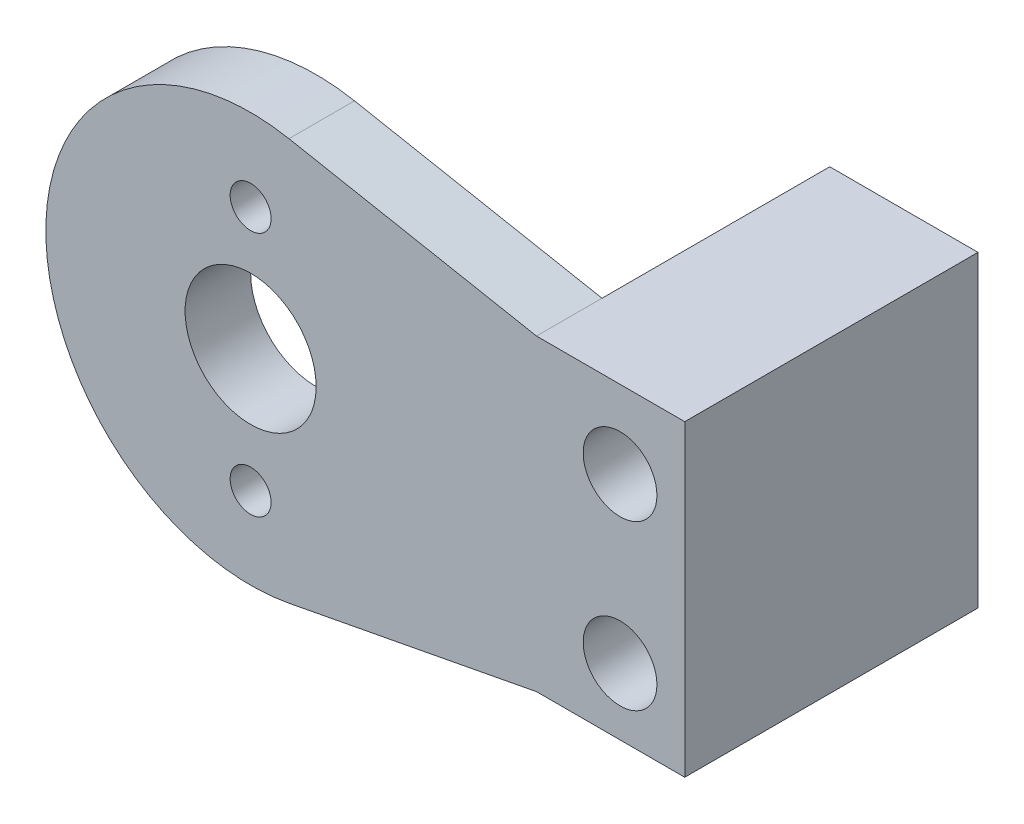
ISO-10303-21;
HEADER;
FILE_DESCRIPTION(('STEP AP214'),'2;1');
FILE_NAME('part.step','',(''),(''),'','','');
FILE_SCHEMA(('AUTOMOTIVE_DESIGN { 1 0 10303 214 1 1 1 1 }'));
ENDSEC;
DATA;
#1=APPLICATION_CONTEXT('core data for automotive mechanical design processes');
#2=APPLICATION_PROTOCOL_DEFINITION('international standard','automotive_design',2000,#1);
#3=PRODUCT_CONTEXT('',#1,'mechanical');
#4=PRODUCT('Part','Part','',(#3));
#5=PRODUCT_RELATED_PRODUCT_CATEGORY('part','',(#4));
#6=PRODUCT_DEFINITION_FORMATION('','',#4);
#7=PRODUCT_DEFINITION_CONTEXT('part definition',#1,'design');
#8=PRODUCT_DEFINITION('design','',#6,#7);
#9=PRODUCT_DEFINITION_SHAPE('','',#8);
#10=(LENGTH_UNIT() NAMED_UNIT(*) SI_UNIT(.MILLI.,.METRE.));
#11=(NAMED_UNIT(*) PLANE_ANGLE_UNIT() SI_UNIT($,.RADIAN.));
#12=(NAMED_UNIT(*) SI_UNIT($,.STERADIAN.) SOLID_ANGLE_UNIT());
#13=UNCERTAINTY_MEASURE_WITH_UNIT(LENGTH_MEASURE(1.E-05),#10,'distance_accuracy_value','');
#14=(GEOMETRIC_REPRESENTATION_CONTEXT(3) GLOBAL_UNCERTAINTY_ASSIGNED_CONTEXT((#13)) GLOBAL_UNIT_ASSIGNED_CONTEXT((#10,
#11,#12)) REPRESENTATION_CONTEXT('',''));
#15=CARTESIAN_POINT('',(0.,0.,0.));
#16=DIRECTION('',(0.,0.,1.));
#17=DIRECTION('',(1.,0.,0.));
#18=AXIS2_PLACEMENT_3D('',#15,#16,#17);
#19=CARTESIAN_POINT('',(0.,0.,83.9405432343483));
#20=DIRECTION('',(0.,-1.,0.));
#21=DIRECTION('',(1.,0.,0.));
#22=AXIS2_PLACEMENT_3D('',#19,#20,#21);
#23=PLANE('',#22);
#24=DIRECTION('',(0.,0.,-1.));
#25=VECTOR('',#24,1.);
#26=CARTESIAN_POINT('',(-9.05,0.,83.9405432343483));
#27=LINE('',#26,#25);
#28=CARTESIAN_POINT('',(-9.05,0.,83.9405432343483));
#29=VERTEX_POINT('',#28);
#30=CARTESIAN_POINT('',(-9.05,0.,79.9405425786972));
#31=VERTEX_POINT('',#30);
#32=EDGE_CURVE('E81',#29,#31,#27,.T.);
#33=ORIENTED_EDGE('',*,*,#32,.T.);
#34=DIRECTION('',(0.,0.,1.));
#35=VECTOR('',#34,1.);
#36=CARTESIAN_POINT('',(-9.05000000000001,0.,66.0405425786972));
#37=LINE('',#36,#35);
#38=CARTESIAN_POINT('',(-9.05000000000001,0.,66.0405425786972));
#39=VERTEX_POINT('',#38);
#40=EDGE_CURVE('E165',#39,#31,#37,.T.);
#41=ORIENTED_EDGE('',*,*,#40,.F.);
#42=DIRECTION('',(-1.,0.,0.));
#43=VECTOR('',#42,1.);
#44=CARTESIAN_POINT('',(-9.05000000000001,0.,66.0405425786972));
#45=LINE('',#44,#43);
#46=CARTESIAN_POINT('',(0.,0.,66.0405425786972));
#47=VERTEX_POINT('',#46);
#48=EDGE_CURVE('E163',#47,#39,#45,.T.);
#49=ORIENTED_EDGE('',*,*,#48,.F.);
#50=DIRECTION('',(0.,0.,-1.));
#51=VECTOR('',#50,1.);
#52=CARTESIAN_POINT('',(0.,0.,83.9405432343483));
#53=LINE('',#52,#51);
#54=CARTESIAN_POINT('',(0.,0.,83.9405432343483));
#55=VERTEX_POINT('',#54);
#56=EDGE_CURVE('E11',#55,#47,#53,.T.);
#57=ORIENTED_EDGE('',*,*,#56,.F.);
#58=DIRECTION('',(-1.,0.,0.));
#59=VECTOR('',#58,1.);
#60=CARTESIAN_POINT('',(0.,0.,83.9405432343483));
#61=LINE('',#60,#59);
#62=EDGE_CURVE('E131',#55,#29,#61,.T.);
#63=ORIENTED_EDGE('',*,*,#62,.T.);
#64=EDGE_LOOP('',(#33,#41,#49,#57,#63));
#65=FACE_BOUND('',#64,.T.);
#66=ADVANCED_FACE('F36',(#65),#23,.T.);
#67=CARTESIAN_POINT('',(0.,18.8,83.9405432343483));
#68=DIRECTION('',(1.,0.,0.));
#69=DIRECTION('',(0.,0.,-1.));
#70=AXIS2_PLACEMENT_3D('',#67,#68,#69);
#71=PLANE('',#70);
#72=ORIENTED_EDGE('',*,*,#56,.T.);
#73=DIRECTION('',(0.,-1.,0.));
#74=VECTOR('',#73,1.);
#75=CARTESIAN_POINT('',(0.,0.,66.0405425786972));
#76=LINE('',#75,#74);
#77=CARTESIAN_POINT('',(0.,18.8,66.0405425786972));
#78=VERTEX_POINT('',#77);
#79=EDGE_CURVE('E187',#78,#47,#76,.T.);
#80=ORIENTED_EDGE('',*,*,#79,.F.);
#81=DIRECTION('',(0.,0.,-1.));
#82=VECTOR('',#81,1.);
#83=CARTESIAN_POINT('',(0.,18.8,83.9405432343483));
#84=LINE('',#83,#82);
#85=CARTESIAN_POINT('',(0.,18.8,83.9405432343483));
#86=VERTEX_POINT('',#85);
#87=EDGE_CURVE('E45',#86,#78,#84,.T.);
#88=ORIENTED_EDGE('',*,*,#87,.F.);
#89=DIRECTION('',(0.,-1.,0.));
#90=VECTOR('',#89,1.);
#91=CARTESIAN_POINT('',(0.,18.8,83.9405432343483));
#92=LINE('',#91,#90);
#93=EDGE_CURVE('E113',#86,#55,#92,.T.);
#94=ORIENTED_EDGE('',*,*,#93,.T.);
#95=EDGE_LOOP('',(#72,#80,#88,#94));
#96=FACE_BOUND('',#95,.T.);
#97=ADVANCED_FACE('F186',(#96),#71,.T.);
#98=CARTESIAN_POINT('',(-9.05,18.8,83.9405432343483));
#99=DIRECTION('',(0.,1.,0.));
#100=DIRECTION('',(-1.,0.,0.));
#101=AXIS2_PLACEMENT_3D('',#98,#99,#100);
#102=PLANE('',#101);
#103=ORIENTED_EDGE('',*,*,#87,.T.);
#104=DIRECTION('',(1.,0.,0.));
#105=VECTOR('',#104,1.);
#106=CARTESIAN_POINT('',(0.,18.8,66.0405425786972));
#107=LINE('',#106,#105);
#108=CARTESIAN_POINT('',(-9.05,18.8,66.0405425786972));
#109=VERTEX_POINT('',#108);
#110=EDGE_CURVE('E159',#109,#78,#107,.T.);
#111=ORIENTED_EDGE('',*,*,#110,.F.);
#112=DIRECTION('',(0.,0.,1.));
#113=VECTOR('',#112,1.);
#114=CARTESIAN_POINT('',(-9.05,18.8,66.0405425786972));
#115=LINE('',#114,#113);
#116=CARTESIAN_POINT('',(-9.05,18.8,79.9405425786972));
#117=VERTEX_POINT('',#116);
#118=EDGE_CURVE('E102',#109,#117,#115,.T.);
#119=ORIENTED_EDGE('',*,*,#118,.T.);
#120=DIRECTION('',(0.,0.,-1.));
#121=VECTOR('',#120,1.);
#122=CARTESIAN_POINT('',(-9.05,18.8,83.9405432343483));
#123=LINE('',#122,#121);
#124=CARTESIAN_POINT('',(-9.05,18.8,83.9405432343483));
#125=VERTEX_POINT('',#124);
#126=EDGE_CURVE('E94',#125,#117,#123,.T.);
#127=ORIENTED_EDGE('',*,*,#126,.F.);
#128=DIRECTION('',(1.,0.,0.));
#129=VECTOR('',#128,1.);
#130=CARTESIAN_POINT('',(-9.05,18.8,83.9405432343483));
#131=LINE('',#130,#129);
#132=EDGE_CURVE('E98',#125,#86,#131,.T.);
#133=ORIENTED_EDGE('',*,*,#132,.T.);
#134=EDGE_LOOP('',(#103,#111,#119,#127,#133));
#135=FACE_BOUND('',#134,.T.);
#136=ADVANCED_FACE('F97',(#135),#102,.T.);
#137=CARTESIAN_POINT('',(-9.05,18.8,83.9405432343483));
#138=DIRECTION('',(0.187170296743463,0.982327481045381,0.));
#139=DIRECTION('',(-0.982327481045381,0.187170296743463,0.));
#140=AXIS2_PLACEMENT_3D('',#137,#138,#139);
#141=PLANE('',#140);
#142=DIRECTION('',(0.982327481045381,-0.187170296743463,0.));
#143=VECTOR('',#142,1.);
#144=CARTESIAN_POINT('',(-9.05,18.8,79.9405425786972));
#145=LINE('',#144,#143);
#146=CARTESIAN_POINT('',(-24.1603712907067,21.6790935130673,79.9405425786972));
#147=VERTEX_POINT('',#146);
#148=EDGE_CURVE('E129',#147,#117,#145,.T.);
#149=ORIENTED_EDGE('',*,*,#148,.F.);
#150=DIRECTION('',(0.,0.,-1.));
#151=VECTOR('',#150,1.);
#152=CARTESIAN_POINT('',(-24.1603712907067,21.6790935130673,83.9405432343483));
#153=LINE('',#152,#151);
#154=CARTESIAN_POINT('',(-24.1603712907067,21.6790935130673,83.9405432343483));
#155=VERTEX_POINT('',#154);
#156=EDGE_CURVE('E75',#155,#147,#153,.T.);
#157=ORIENTED_EDGE('',*,*,#156,.F.);
#158=DIRECTION('',(0.982327481045381,-0.187170296743463,0.));
#159=VECTOR('',#158,1.);
#160=CARTESIAN_POINT('',(-9.05,18.8,83.9405432343483));
#161=LINE('',#160,#159);
#162=EDGE_CURVE('E111',#155,#125,#161,.T.);
#163=ORIENTED_EDGE('',*,*,#162,.T.);
#164=ORIENTED_EDGE('',*,*,#126,.T.);
#165=EDGE_LOOP('',(#149,#157,#163,#164));
#166=FACE_BOUND('',#165,.T.);
#167=ADVANCED_FACE('F115',(#166),#141,.T.);
#168=CARTESIAN_POINT('',(-26.5,9.40000000000001,83.9405432343483));
#169=DIRECTION('',(0.,0.,-1.));
#170=DIRECTION('',(-1.,0.,0.));
#171=AXIS2_PLACEMENT_3D('',#168,#169,#170);
#172=CYLINDRICAL_SURFACE('',#171,12.5);
#173=CARTESIAN_POINT('',(-26.5,9.40000000000001,79.9405425786972));
#174=DIRECTION('',(0.,0.,-1.));
#175=DIRECTION('',(-1.,0.,0.));
#176=AXIS2_PLACEMENT_3D('',#173,#174,#175);
#177=CIRCLE('',#176,12.5);
#178=CARTESIAN_POINT('',(-24.1603712907067,-2.87909351306726,79.9405425786972));
#179=VERTEX_POINT('',#178);
#180=EDGE_CURVE('E126',#179,#147,#177,.T.);
#181=ORIENTED_EDGE('',*,*,#180,.F.);
#182=DIRECTION('',(0.,0.,-1.));
#183=VECTOR('',#182,1.);
#184=CARTESIAN_POINT('',(-24.1603712907067,-2.87909351306726,83.9405432343483));
#185=LINE('',#184,#183);
#186=CARTESIAN_POINT('',(-24.1603712907067,-2.87909351306726,83.9405432343483));
#187=VERTEX_POINT('',#186);
#188=EDGE_CURVE('E68',#187,#179,#185,.T.);
#189=ORIENTED_EDGE('',*,*,#188,.F.);
#190=CARTESIAN_POINT('',(-26.5,9.40000000000001,83.9405432343483));
#191=DIRECTION('',(0.,0.,-1.));
#192=DIRECTION('',(-1.,0.,0.));
#193=AXIS2_PLACEMENT_3D('',#190,#191,#192);
#194=CIRCLE('',#193,12.5);
#195=EDGE_CURVE('E116',#187,#155,#194,.T.);
#196=ORIENTED_EDGE('',*,*,#195,.T.);
#197=ORIENTED_EDGE('',*,*,#156,.T.);
#198=EDGE_LOOP('',(#181,#189,#196,#197));
#199=FACE_BOUND('',#198,.T.);
#200=ADVANCED_FACE('F244',(#199),#172,.T.);
#201=CARTESIAN_POINT('',(-9.05,0.,83.9405432343483));
#202=DIRECTION('',(0.187170296743462,-0.982327481045381,0.));
#203=DIRECTION('',(0.982327481045382,0.187170296743462,0.));
#204=AXIS2_PLACEMENT_3D('',#201,#202,#203);
#205=PLANE('',#204);
#206=DIRECTION('',(-0.982327481045382,-0.187170296743462,0.));
#207=VECTOR('',#206,1.);
#208=CARTESIAN_POINT('',(-9.05,0.,79.9405425786972));
#209=LINE('',#208,#207);
#210=EDGE_CURVE('E123',#31,#179,#209,.T.);
#211=ORIENTED_EDGE('',*,*,#210,.F.);
#212=ORIENTED_EDGE('',*,*,#32,.F.);
#213=DIRECTION('',(-0.982327481045382,-0.187170296743462,0.));
#214=VECTOR('',#213,1.);
#215=CARTESIAN_POINT('',(-9.05,0.,83.9405432343483));
#216=LINE('',#215,#214);
#217=EDGE_CURVE('E118',#29,#187,#216,.T.);
#218=ORIENTED_EDGE('',*,*,#217,.T.);
#219=ORIENTED_EDGE('',*,*,#188,.T.);
#220=EDGE_LOOP('',(#211,#212,#218,#219));
#221=FACE_BOUND('',#220,.T.);
#222=ADVANCED_FACE('F168',(#221),#205,.T.);
#223=CARTESIAN_POINT('',(-26.5,9.40000000000001,83.9405432343483));
#224=DIRECTION('',(0.,0.,-1.));
#225=DIRECTION('',(-1.,0.,0.));
#226=AXIS2_PLACEMENT_3D('',#223,#224,#225);
#227=PLANE('',#226);
#228=CARTESIAN_POINT('',(-26.5,1.9,83.9405432343483));
#229=DIRECTION('',(0.,0.,1.));
#230=DIRECTION('',(1.,0.,0.));
#231=AXIS2_PLACEMENT_3D('',#228,#229,#230);
#232=CIRCLE('',#231,1.25);
#233=CARTESIAN_POINT('',(-25.25,1.9,83.9405432343483));
#234=VERTEX_POINT('',#233);
#235=EDGE_CURVE('E193',#234,#234,#232,.T.);
#236=ORIENTED_EDGE('',*,*,#235,.F.);
#237=EDGE_LOOP('',(#236));
#238=FACE_BOUND('',#237,.T.);
#239=CARTESIAN_POINT('',(-26.5,16.9,83.9405432343483));
#240=DIRECTION('',(0.,0.,1.));
#241=DIRECTION('',(1.,0.,0.));
#242=AXIS2_PLACEMENT_3D('',#239,#240,#241);
#243=CIRCLE('',#242,1.25);
#244=CARTESIAN_POINT('',(-25.25,16.9,83.9405432343483));
#245=VERTEX_POINT('',#244);
#246=EDGE_CURVE('E196',#245,#245,#243,.T.);
#247=ORIENTED_EDGE('',*,*,#246,.F.);
#248=EDGE_LOOP('',(#247));
#249=FACE_BOUND('',#248,.T.);
#250=CARTESIAN_POINT('',(-3.95,4.05,83.9405432343483));
#251=DIRECTION('',(0.,0.,1.));
#252=DIRECTION('',(1.,0.,0.));
#253=AXIS2_PLACEMENT_3D('',#250,#251,#252);
#254=CIRCLE('',#253,2.25);
#255=CARTESIAN_POINT('',(-1.7,4.05,83.9405432343483));
#256=VERTEX_POINT('',#255);
#257=EDGE_CURVE('E199',#256,#256,#254,.T.);
#258=ORIENTED_EDGE('',*,*,#257,.F.);
#259=EDGE_LOOP('',(#258));
#260=FACE_BOUND('',#259,.T.);
#261=CARTESIAN_POINT('',(-3.95,14.05,83.9405432343483));
#262=DIRECTION('',(0.,0.,1.));
#263=DIRECTION('',(1.,0.,0.));
#264=AXIS2_PLACEMENT_3D('',#261,#262,#263);
#265=CIRCLE('',#264,2.25);
#266=CARTESIAN_POINT('',(-1.7,14.05,83.9405432343483));
#267=VERTEX_POINT('',#266);
#268=EDGE_CURVE('E192',#267,#267,#265,.T.);
#269=ORIENTED_EDGE('',*,*,#268,.F.);
#270=EDGE_LOOP('',(#269));
#271=FACE_BOUND('',#270,.T.);
#272=CARTESIAN_POINT('',(-26.5,9.40000000000001,83.9405432343483));
#273=DIRECTION('',(0.,0.,1.));
#274=DIRECTION('',(1.,0.,0.));
#275=AXIS2_PLACEMENT_3D('',#272,#273,#274);
#276=CIRCLE('',#275,4.);
#277=CARTESIAN_POINT('',(-22.5,9.40000000000001,83.9405432343483));
#278=VERTEX_POINT('',#277);
#279=EDGE_CURVE('E141',#278,#278,#276,.T.);
#280=ORIENTED_EDGE('',*,*,#279,.F.);
#281=EDGE_LOOP('',(#280));
#282=FACE_BOUND('',#281,.T.);
#283=ORIENTED_EDGE('',*,*,#62,.F.);
#284=ORIENTED_EDGE('',*,*,#93,.F.);
#285=ORIENTED_EDGE('',*,*,#132,.F.);
#286=ORIENTED_EDGE('',*,*,#162,.F.);
#287=ORIENTED_EDGE('',*,*,#195,.F.);
#288=ORIENTED_EDGE('',*,*,#217,.F.);
#289=EDGE_LOOP('',(#283,#284,#285,#286,#287,#288));
#290=FACE_BOUND('',#289,.T.);
#291=ADVANCED_FACE('F109',(#238,#249,#260,#271,#282,#290),#227,.F.);
#292=CARTESIAN_POINT('',(-26.5,9.40000000000001,79.9405425786972));
#293=DIRECTION('',(0.,0.,-1.));
#294=DIRECTION('',(-1.,0.,0.));
#295=AXIS2_PLACEMENT_3D('',#292,#293,#294);
#296=PLANE('',#295);
#297=CARTESIAN_POINT('',(-26.5,1.9,79.9405425786972));
#298=DIRECTION('',(0.,0.,-1.));
#299=DIRECTION('',(-1.,0.,0.));
#300=AXIS2_PLACEMENT_3D('',#297,#298,#299);
#301=CIRCLE('',#300,1.25);
#302=CARTESIAN_POINT('',(-27.75,1.9,79.9405425786972));
#303=VERTEX_POINT('',#302);
#304=EDGE_CURVE('E39',#303,#303,#301,.T.);
#305=ORIENTED_EDGE('',*,*,#304,.F.);
#306=EDGE_LOOP('',(#305));
#307=FACE_BOUND('',#306,.T.);
#308=CARTESIAN_POINT('',(-26.5,16.9,79.9405425786972));
#309=DIRECTION('',(0.,0.,-1.));
#310=DIRECTION('',(-1.,0.,0.));
#311=AXIS2_PLACEMENT_3D('',#308,#309,#310);
#312=CIRCLE('',#311,1.25);
#313=CARTESIAN_POINT('',(-27.75,16.9,79.9405425786972));
#314=VERTEX_POINT('',#313);
#315=EDGE_CURVE('E146',#314,#314,#312,.T.);
#316=ORIENTED_EDGE('',*,*,#315,.F.);
#317=EDGE_LOOP('',(#316));
#318=FACE_BOUND('',#317,.T.);
#319=CARTESIAN_POINT('',(-26.5,9.40000000000001,79.9405425786972));
#320=DIRECTION('',(0.,0.,-1.));
#321=DIRECTION('',(-1.,0.,0.));
#322=AXIS2_PLACEMENT_3D('',#319,#320,#321);
#323=CIRCLE('',#322,4.);
#324=CARTESIAN_POINT('',(-30.5,9.40000000000001,79.9405425786972));
#325=VERTEX_POINT('',#324);
#326=EDGE_CURVE('E144',#325,#325,#323,.T.);
#327=ORIENTED_EDGE('',*,*,#326,.F.);
#328=EDGE_LOOP('',(#327));
#329=FACE_BOUND('',#328,.T.);
#330=DIRECTION('',(0.,1.,0.));
#331=VECTOR('',#330,1.);
#332=CARTESIAN_POINT('',(-9.05,18.8,79.9405425786972));
#333=LINE('',#332,#331);
#334=EDGE_CURVE('E151',#31,#117,#333,.T.);
#335=ORIENTED_EDGE('',*,*,#334,.F.);
#336=ORIENTED_EDGE('',*,*,#210,.T.);
#337=ORIENTED_EDGE('',*,*,#180,.T.);
#338=ORIENTED_EDGE('',*,*,#148,.T.);
#339=EDGE_LOOP('',(#335,#336,#337,#338));
#340=FACE_BOUND('',#339,.T.);
#341=ADVANCED_FACE('F210',(#307,#318,#329,#340),#296,.T.);
#342=CARTESIAN_POINT('',(-9.05,18.8,66.0405425786972));
#343=DIRECTION('',(1.,0.,0.));
#344=DIRECTION('',(0.,1.,0.));
#345=AXIS2_PLACEMENT_3D('',#342,#343,#344);
#346=PLANE('',#345);
#347=ORIENTED_EDGE('',*,*,#334,.T.);
#348=ORIENTED_EDGE('',*,*,#118,.F.);
#349=DIRECTION('',(0.,1.,0.));
#350=VECTOR('',#349,1.);
#351=CARTESIAN_POINT('',(-9.05,18.8,66.0405425786972));
#352=LINE('',#351,#350);
#353=EDGE_CURVE('E154',#39,#109,#352,.T.);
#354=ORIENTED_EDGE('',*,*,#353,.F.);
#355=ORIENTED_EDGE('',*,*,#40,.T.);
#356=EDGE_LOOP('',(#347,#348,#354,#355));
#357=FACE_BOUND('',#356,.T.);
#358=ADVANCED_FACE('F172',(#357),#346,.F.);
#359=CARTESIAN_POINT('',(0.,0.,66.0405425786972));
#360=DIRECTION('',(0.,0.,1.));
#361=DIRECTION('',(1.,0.,0.));
#362=AXIS2_PLACEMENT_3D('',#359,#360,#361);
#363=PLANE('',#362);
#364=CARTESIAN_POINT('',(-3.95,4.05,66.0405425786972));
#365=DIRECTION('',(0.,0.,1.));
#366=DIRECTION('',(1.,0.,0.));
#367=AXIS2_PLACEMENT_3D('',#364,#365,#366);
#368=CIRCLE('',#367,2.25);
#369=CARTESIAN_POINT('',(-1.7,4.05,66.0405425786972));
#370=VERTEX_POINT('',#369);
#371=EDGE_CURVE('E140',#370,#370,#368,.T.);
#372=ORIENTED_EDGE('',*,*,#371,.T.);
#373=EDGE_LOOP('',(#372));
#374=FACE_BOUND('',#373,.T.);
#375=CARTESIAN_POINT('',(-3.95,14.05,66.0405425786972));
#376=DIRECTION('',(0.,0.,1.));
#377=DIRECTION('',(1.,0.,0.));
#378=AXIS2_PLACEMENT_3D('',#375,#376,#377);
#379=CIRCLE('',#378,2.25);
#380=CARTESIAN_POINT('',(-1.7,14.05,66.0405425786972));
#381=VERTEX_POINT('',#380);
#382=EDGE_CURVE('E137',#381,#381,#379,.T.);
#383=ORIENTED_EDGE('',*,*,#382,.T.);
#384=EDGE_LOOP('',(#383));
#385=FACE_BOUND('',#384,.T.);
#386=ORIENTED_EDGE('',*,*,#353,.T.);
#387=ORIENTED_EDGE('',*,*,#110,.T.);
#388=ORIENTED_EDGE('',*,*,#79,.T.);
#389=ORIENTED_EDGE('',*,*,#48,.T.);
#390=EDGE_LOOP('',(#386,#387,#388,#389));
#391=FACE_BOUND('',#390,.T.);
#392=ADVANCED_FACE('F178',(#374,#385,#391),#363,.F.);
#393=CARTESIAN_POINT('',(-3.95,14.05,53.9405432343483));
#394=DIRECTION('',(0.,0.,1.));
#395=DIRECTION('',(1.,0.,0.));
#396=AXIS2_PLACEMENT_3D('',#393,#394,#395);
#397=CYLINDRICAL_SURFACE('',#396,2.25);
#398=ORIENTED_EDGE('',*,*,#268,.T.);
#399=EDGE_LOOP('',(#398));
#400=FACE_BOUND('',#399,.T.);
#401=ORIENTED_EDGE('',*,*,#382,.F.);
#402=EDGE_LOOP('',(#401));
#403=FACE_BOUND('',#402,.T.);
#404=ADVANCED_FACE('F205',(#400,#403),#397,.F.);
#405=CARTESIAN_POINT('',(-3.95,4.05,53.9405432343483));
#406=DIRECTION('',(0.,0.,1.));
#407=DIRECTION('',(1.,0.,0.));
#408=AXIS2_PLACEMENT_3D('',#405,#406,#407);
#409=CYLINDRICAL_SURFACE('',#408,2.25);
#410=ORIENTED_EDGE('',*,*,#257,.T.);
#411=EDGE_LOOP('',(#410));
#412=FACE_BOUND('',#411,.T.);
#413=ORIENTED_EDGE('',*,*,#371,.F.);
#414=EDGE_LOOP('',(#413));
#415=FACE_BOUND('',#414,.T.);
#416=ADVANCED_FACE('F218',(#412,#415),#409,.F.);
#417=CARTESIAN_POINT('',(-26.5,9.40000000000001,53.9405432343483));
#418=DIRECTION('',(0.,0.,1.));
#419=DIRECTION('',(1.,0.,0.));
#420=AXIS2_PLACEMENT_3D('',#417,#418,#419);
#421=CYLINDRICAL_SURFACE('',#420,4.);
#422=ORIENTED_EDGE('',*,*,#326,.T.);
#423=EDGE_LOOP('',(#422));
#424=FACE_BOUND('',#423,.T.);
#425=ORIENTED_EDGE('',*,*,#279,.T.);
#426=EDGE_LOOP('',(#425));
#427=FACE_BOUND('',#426,.T.);
#428=ADVANCED_FACE('F215',(#424,#427),#421,.F.);
#429=CARTESIAN_POINT('',(-26.5,16.9,53.9405432343483));
#430=DIRECTION('',(0.,0.,1.));
#431=DIRECTION('',(1.,0.,0.));
#432=AXIS2_PLACEMENT_3D('',#429,#430,#431);
#433=CYLINDRICAL_SURFACE('',#432,1.25);
#434=ORIENTED_EDGE('',*,*,#315,.T.);
#435=EDGE_LOOP('',(#434));
#436=FACE_BOUND('',#435,.T.);
#437=ORIENTED_EDGE('',*,*,#246,.T.);
#438=EDGE_LOOP('',(#437));
#439=FACE_BOUND('',#438,.T.);
#440=ADVANCED_FACE('F217',(#436,#439),#433,.F.);
#441=CARTESIAN_POINT('',(-26.5,1.9,53.9405432343483));
#442=DIRECTION('',(0.,0.,1.));
#443=DIRECTION('',(1.,0.,0.));
#444=AXIS2_PLACEMENT_3D('',#441,#442,#443);
#445=CYLINDRICAL_SURFACE('',#444,1.25);
#446=ORIENTED_EDGE('',*,*,#304,.T.);
#447=EDGE_LOOP('',(#446));
#448=FACE_BOUND('',#447,.T.);
#449=ORIENTED_EDGE('',*,*,#235,.T.);
#450=EDGE_LOOP('',(#449));
#451=FACE_BOUND('',#450,.T.);
#452=ADVANCED_FACE('F225',(#448,#451),#445,.F.);
#453=CLOSED_SHELL('',(#66,#97,#136,#167,#200,#222,#291,#341,#358,#392,#404,#416,#428,#440,#452));
#454=MANIFOLD_SOLID_BREP('B2',#453);
#455=ADVANCED_BREP_SHAPE_REPRESENTATION('',(#18,#454),#14);
#456=SHAPE_DEFINITION_REPRESENTATION(#9,#455);
ENDSEC;
END-ISO-10303-21;
